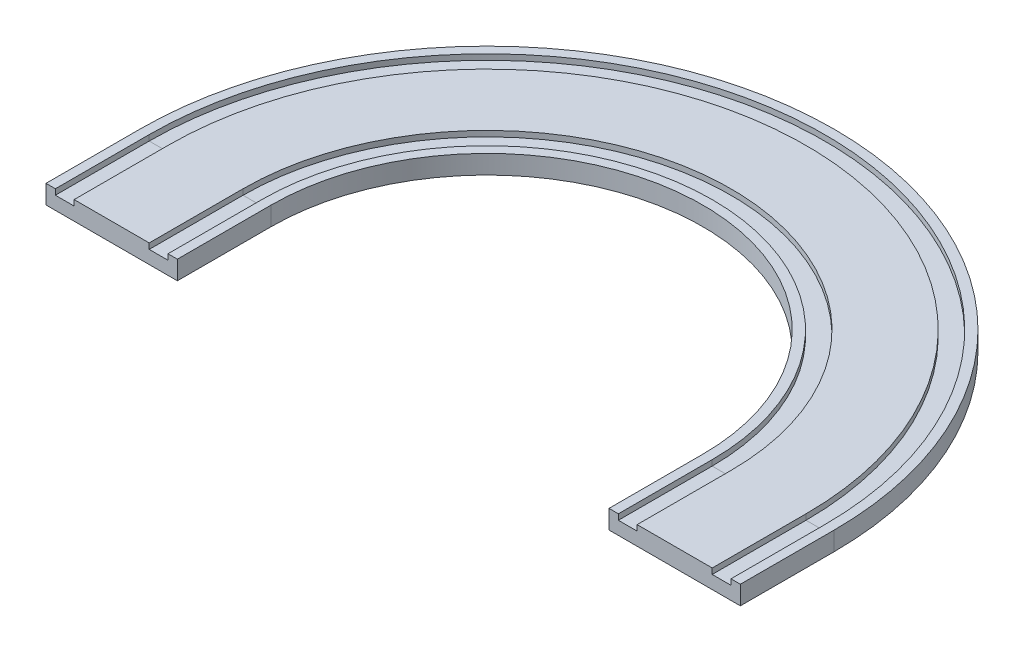
ISO-10303-21;
HEADER;
FILE_DESCRIPTION(('STEP AP214'),'2;1');
FILE_NAME('part.step','',(''),(''),'','','');
FILE_SCHEMA(('AUTOMOTIVE_DESIGN { 1 0 10303 214 1 1 1 1 }'));
ENDSEC;
DATA;
#1=APPLICATION_CONTEXT('core data for automotive mechanical design processes');
#2=APPLICATION_PROTOCOL_DEFINITION('international standard','automotive_design',2000,#1);
#3=PRODUCT_CONTEXT('',#1,'mechanical');
#4=PRODUCT('Part','Part','',(#3));
#5=PRODUCT_RELATED_PRODUCT_CATEGORY('part','',(#4));
#6=PRODUCT_DEFINITION_FORMATION('','',#4);
#7=PRODUCT_DEFINITION_CONTEXT('part definition',#1,'design');
#8=PRODUCT_DEFINITION('design','',#6,#7);
#9=PRODUCT_DEFINITION_SHAPE('','',#8);
#10=(LENGTH_UNIT() NAMED_UNIT(*) SI_UNIT(.MILLI.,.METRE.));
#11=(NAMED_UNIT(*) PLANE_ANGLE_UNIT() SI_UNIT($,.RADIAN.));
#12=(NAMED_UNIT(*) SI_UNIT($,.STERADIAN.) SOLID_ANGLE_UNIT());
#13=UNCERTAINTY_MEASURE_WITH_UNIT(LENGTH_MEASURE(1.E-05),#10,'distance_accuracy_value','');
#14=(GEOMETRIC_REPRESENTATION_CONTEXT(3) GLOBAL_UNCERTAINTY_ASSIGNED_CONTEXT((#13)) GLOBAL_UNIT_ASSIGNED_CONTEXT((#10,
#11,#12)) REPRESENTATION_CONTEXT('',''));
#15=CARTESIAN_POINT('',(0.,0.,0.));
#16=DIRECTION('',(0.,0.,1.));
#17=DIRECTION('',(1.,0.,0.));
#18=AXIS2_PLACEMENT_3D('',#15,#16,#17);
#19=CARTESIAN_POINT('',(265.,10.,8.04911692853238E-13));
#20=DIRECTION('',(0.,0.,-1.));
#21=DIRECTION('',(-1.,0.,0.));
#22=AXIS2_PLACEMENT_3D('',#19,#20,#21);
#23=PLANE('',#22);
#24=DIRECTION('',(0.,-1.,0.));
#25=VECTOR('',#24,1.);
#26=CARTESIAN_POINT('',(280.,10.,9.29811783123569E-13));
#27=LINE('',#26,#25);
#28=CARTESIAN_POINT('',(280.,10.,9.29811783123569E-13));
#29=VERTEX_POINT('',#28);
#30=CARTESIAN_POINT('',(280.,7.,9.29811783123572E-13));
#31=VERTEX_POINT('',#30);
#32=EDGE_CURVE('E462',#29,#31,#27,.T.);
#33=ORIENTED_EDGE('',*,*,#32,.T.);
#34=DIRECTION('',(-1.,0.,0.));
#35=VECTOR('',#34,1.);
#36=CARTESIAN_POINT('',(270.,7.,8.46545056276682E-13));
#37=LINE('',#36,#35);
#38=CARTESIAN_POINT('',(270.,7.,8.46545056276682E-13));
#39=VERTEX_POINT('',#38);
#40=EDGE_CURVE('E319',#31,#39,#37,.T.);
#41=ORIENTED_EDGE('',*,*,#40,.T.);
#42=DIRECTION('',(0.,1.,0.));
#43=VECTOR('',#42,1.);
#44=CARTESIAN_POINT('',(270.,10.,8.46545056276682E-13));
#45=LINE('',#44,#43);
#46=CARTESIAN_POINT('',(270.,10.,8.46545056276682E-13));
#47=VERTEX_POINT('',#46);
#48=EDGE_CURVE('E459',#39,#47,#45,.T.);
#49=ORIENTED_EDGE('',*,*,#48,.T.);
#50=DIRECTION('',(1.,0.,0.));
#51=VECTOR('',#50,1.);
#52=CARTESIAN_POINT('',(265.,10.,8.04911692853238E-13));
#53=LINE('',#52,#51);
#54=CARTESIAN_POINT('',(265.,10.,8.04911692853238E-13));
#55=VERTEX_POINT('',#54);
#56=EDGE_CURVE('E338',#55,#47,#53,.T.);
#57=ORIENTED_EDGE('',*,*,#56,.F.);
#58=DIRECTION('',(0.,-1.,0.));
#59=VECTOR('',#58,1.);
#60=CARTESIAN_POINT('',(265.,10.,8.04911692853238E-13));
#61=LINE('',#60,#59);
#62=CARTESIAN_POINT('',(265.,0.,8.04911692853238E-13));
#63=VERTEX_POINT('',#62);
#64=EDGE_CURVE('E382',#55,#63,#61,.T.);
#65=ORIENTED_EDGE('',*,*,#64,.T.);
#66=DIRECTION('',(1.,0.,0.));
#67=VECTOR('',#66,1.);
#68=CARTESIAN_POINT('',(265.,0.,8.04911692853238E-13));
#69=LINE('',#68,#67);
#70=CARTESIAN_POINT('',(335.,0.,1.38777878078145E-12));
#71=VERTEX_POINT('',#70);
#72=EDGE_CURVE('E359',#63,#71,#69,.T.);
#73=ORIENTED_EDGE('',*,*,#72,.T.);
#74=DIRECTION('',(0.,-1.,0.));
#75=VECTOR('',#74,1.);
#76=CARTESIAN_POINT('',(335.,10.,1.38777878078145E-12));
#77=LINE('',#76,#75);
#78=CARTESIAN_POINT('',(335.,10.,1.38777878078145E-12));
#79=VERTEX_POINT('',#78);
#80=EDGE_CURVE('E379',#79,#71,#77,.T.);
#81=ORIENTED_EDGE('',*,*,#80,.F.);
#82=CARTESIAN_POINT('',(330.,10.,1.30451205393456E-12));
#83=VERTEX_POINT('',#82);
#84=EDGE_CURVE('E337',#83,#79,#53,.T.);
#85=ORIENTED_EDGE('',*,*,#84,.F.);
#86=DIRECTION('',(0.,-1.,0.));
#87=VECTOR('',#86,1.);
#88=CARTESIAN_POINT('',(330.,10.,1.346145417358E-12));
#89=LINE('',#88,#87);
#90=CARTESIAN_POINT('',(330.,7.,1.34614541735801E-12));
#91=VERTEX_POINT('',#90);
#92=EDGE_CURVE('E269',#83,#91,#89,.T.);
#93=ORIENTED_EDGE('',*,*,#92,.T.);
#94=DIRECTION('',(-1.,0.,0.));
#95=VECTOR('',#94,1.);
#96=CARTESIAN_POINT('',(330.,7.,1.346145417358E-12));
#97=LINE('',#96,#95);
#98=CARTESIAN_POINT('',(320.,7.,1.26287869051112E-12));
#99=VERTEX_POINT('',#98);
#100=EDGE_CURVE('E266',#91,#99,#97,.T.);
#101=ORIENTED_EDGE('',*,*,#100,.T.);
#102=DIRECTION('',(0.,1.,0.));
#103=VECTOR('',#102,1.);
#104=CARTESIAN_POINT('',(320.,10.,1.26287869051112E-12));
#105=LINE('',#104,#103);
#106=CARTESIAN_POINT('',(320.,10.,1.26287869051112E-12));
#107=VERTEX_POINT('',#106);
#108=EDGE_CURVE('E262',#99,#107,#105,.T.);
#109=ORIENTED_EDGE('',*,*,#108,.T.);
#110=EDGE_CURVE('E342',#29,#107,#53,.T.);
#111=ORIENTED_EDGE('',*,*,#110,.F.);
#112=EDGE_LOOP('',(#33,#41,#49,#57,#65,#73,#81,#85,#93,#101,#109,#111));
#113=FACE_BOUND('',#112,.T.);
#114=ADVANCED_FACE('F59',(#113),#23,.F.);
#115=CARTESIAN_POINT('',(-35.,10.,0.));
#116=DIRECTION('',(0.,0.,-1.));
#117=DIRECTION('',(-1.,0.,0.));
#118=AXIS2_PLACEMENT_3D('',#115,#116,#117);
#119=PLANE('',#118);
#120=DIRECTION('',(0.,1.,0.));
#121=VECTOR('',#120,1.);
#122=CARTESIAN_POINT('',(20.,10.,0.));
#123=LINE('',#122,#121);
#124=CARTESIAN_POINT('',(20.,7.,0.));
#125=VERTEX_POINT('',#124);
#126=CARTESIAN_POINT('',(20.,10.,0.));
#127=VERTEX_POINT('',#126);
#128=EDGE_CURVE('E254',#125,#127,#123,.T.);
#129=ORIENTED_EDGE('',*,*,#128,.T.);
#130=DIRECTION('',(1.,0.,0.));
#131=VECTOR('',#130,1.);
#132=CARTESIAN_POINT('',(-35.,10.,0.));
#133=LINE('',#132,#131);
#134=CARTESIAN_POINT('',(-20.,10.,0.));
#135=VERTEX_POINT('',#134);
#136=EDGE_CURVE('E352',#135,#127,#133,.T.);
#137=ORIENTED_EDGE('',*,*,#136,.F.);
#138=DIRECTION('',(0.,-1.,0.));
#139=VECTOR('',#138,1.);
#140=CARTESIAN_POINT('',(-20.,10.,0.));
#141=LINE('',#140,#139);
#142=CARTESIAN_POINT('',(-20.,7.,0.));
#143=VERTEX_POINT('',#142);
#144=EDGE_CURVE('E297',#135,#143,#141,.T.);
#145=ORIENTED_EDGE('',*,*,#144,.T.);
#146=DIRECTION('',(-1.,0.,0.));
#147=VECTOR('',#146,1.);
#148=CARTESIAN_POINT('',(-30.,7.,0.));
#149=LINE('',#148,#147);
#150=CARTESIAN_POINT('',(-30.,7.,0.));
#151=VERTEX_POINT('',#150);
#152=EDGE_CURVE('E314',#143,#151,#149,.T.);
#153=ORIENTED_EDGE('',*,*,#152,.T.);
#154=DIRECTION('',(0.,1.,0.));
#155=VECTOR('',#154,1.);
#156=CARTESIAN_POINT('',(-30.,10.,0.));
#157=LINE('',#156,#155);
#158=CARTESIAN_POINT('',(-30.,10.,0.));
#159=VERTEX_POINT('',#158);
#160=EDGE_CURVE('E316',#151,#159,#157,.T.);
#161=ORIENTED_EDGE('',*,*,#160,.T.);
#162=CARTESIAN_POINT('',(-35.,10.,0.));
#163=VERTEX_POINT('',#162);
#164=EDGE_CURVE('E348',#163,#159,#133,.T.);
#165=ORIENTED_EDGE('',*,*,#164,.F.);
#166=DIRECTION('',(0.,-1.,0.));
#167=VECTOR('',#166,1.);
#168=CARTESIAN_POINT('',(-35.,10.,0.));
#169=LINE('',#168,#167);
#170=CARTESIAN_POINT('',(-35.,0.,0.));
#171=VERTEX_POINT('',#170);
#172=EDGE_CURVE('E370',#163,#171,#169,.T.);
#173=ORIENTED_EDGE('',*,*,#172,.T.);
#174=DIRECTION('',(1.,0.,0.));
#175=VECTOR('',#174,1.);
#176=CARTESIAN_POINT('',(-35.,0.,0.));
#177=LINE('',#176,#175);
#178=CARTESIAN_POINT('',(35.,0.,0.));
#179=VERTEX_POINT('',#178);
#180=EDGE_CURVE('E333',#171,#179,#177,.T.);
#181=ORIENTED_EDGE('',*,*,#180,.T.);
#182=DIRECTION('',(0.,-1.,0.));
#183=VECTOR('',#182,1.);
#184=CARTESIAN_POINT('',(35.,10.,0.));
#185=LINE('',#184,#183);
#186=CARTESIAN_POINT('',(35.,10.,0.));
#187=VERTEX_POINT('',#186);
#188=EDGE_CURVE('E351',#187,#179,#185,.T.);
#189=ORIENTED_EDGE('',*,*,#188,.F.);
#190=CARTESIAN_POINT('',(30.,10.,0.));
#191=VERTEX_POINT('',#190);
#192=EDGE_CURVE('E246',#191,#187,#133,.T.);
#193=ORIENTED_EDGE('',*,*,#192,.F.);
#194=DIRECTION('',(0.,-1.,0.));
#195=VECTOR('',#194,1.);
#196=CARTESIAN_POINT('',(30.,10.,0.));
#197=LINE('',#196,#195);
#198=CARTESIAN_POINT('',(30.,7.,0.));
#199=VERTEX_POINT('',#198);
#200=EDGE_CURVE('E238',#191,#199,#197,.T.);
#201=ORIENTED_EDGE('',*,*,#200,.T.);
#202=DIRECTION('',(-1.,0.,0.));
#203=VECTOR('',#202,1.);
#204=CARTESIAN_POINT('',(30.,7.,0.));
#205=LINE('',#204,#203);
#206=EDGE_CURVE('E223',#199,#125,#205,.T.);
#207=ORIENTED_EDGE('',*,*,#206,.T.);
#208=EDGE_LOOP('',(#129,#137,#145,#153,#161,#165,#173,#181,#189,#193,#201,#207));
#209=FACE_BOUND('',#208,.T.);
#210=ADVANCED_FACE('F244',(#209),#119,.F.);
#211=CARTESIAN_POINT('',(150.,10.,-50.));
#212=DIRECTION('',(0.,-1.,0.));
#213=DIRECTION('',(0.,0.,-1.));
#214=AXIS2_PLACEMENT_3D('',#211,#212,#213);
#215=PLANE('',#214);
#216=DIRECTION('',(0.,0.,-1.));
#217=VECTOR('',#216,1.);
#218=CARTESIAN_POINT('',(20.,10.,5.));
#219=LINE('',#218,#217);
#220=CARTESIAN_POINT('',(20.,10.,-50.));
#221=VERTEX_POINT('',#220);
#222=EDGE_CURVE('E255',#127,#221,#219,.T.);
#223=ORIENTED_EDGE('',*,*,#222,.T.);
#224=CARTESIAN_POINT('',(150.,10.,-50.));
#225=DIRECTION('',(0.,-1.,0.));
#226=DIRECTION('',(-1.,0.,0.));
#227=AXIS2_PLACEMENT_3D('',#224,#225,#226);
#228=CIRCLE('',#227,130.);
#229=CARTESIAN_POINT('',(280.,10.,-49.9999999999991));
#230=VERTEX_POINT('',#229);
#231=EDGE_CURVE('E251',#221,#230,#228,.T.);
#232=ORIENTED_EDGE('',*,*,#231,.T.);
#233=DIRECTION('',(0.,0.,1.));
#234=VECTOR('',#233,1.);
#235=CARTESIAN_POINT('',(280.,10.,-49.9999999999991));
#236=LINE('',#235,#234);
#237=EDGE_CURVE('E418',#230,#29,#236,.T.);
#238=ORIENTED_EDGE('',*,*,#237,.T.);
#239=ORIENTED_EDGE('',*,*,#110,.T.);
#240=DIRECTION('',(0.,0.,1.));
#241=VECTOR('',#240,1.);
#242=CARTESIAN_POINT('',(320.,10.,-49.9999999999988));
#243=LINE('',#242,#241);
#244=CARTESIAN_POINT('',(320.,10.,-49.9999999999988));
#245=VERTEX_POINT('',#244);
#246=EDGE_CURVE('E272',#245,#107,#243,.T.);
#247=ORIENTED_EDGE('',*,*,#246,.F.);
#248=CARTESIAN_POINT('',(150.,10.,-50.));
#249=DIRECTION('',(0.,-1.,0.));
#250=DIRECTION('',(-1.,0.,0.));
#251=AXIS2_PLACEMENT_3D('',#248,#249,#250);
#252=CIRCLE('',#251,170.);
#253=CARTESIAN_POINT('',(-20.,10.,-50.));
#254=VERTEX_POINT('',#253);
#255=EDGE_CURVE('E275',#254,#245,#252,.T.);
#256=ORIENTED_EDGE('',*,*,#255,.F.);
#257=DIRECTION('',(0.,0.,-1.));
#258=VECTOR('',#257,1.);
#259=CARTESIAN_POINT('',(-20.,10.,5.));
#260=LINE('',#259,#258);
#261=EDGE_CURVE('E283',#135,#254,#260,.T.);
#262=ORIENTED_EDGE('',*,*,#261,.F.);
#263=ORIENTED_EDGE('',*,*,#136,.T.);
#264=EDGE_LOOP('',(#223,#232,#238,#239,#247,#256,#262,#263));
#265=FACE_BOUND('',#264,.T.);
#266=ADVANCED_FACE('F415',(#265),#215,.F.);
#267=DIRECTION('',(0.,0.,-1.));
#268=VECTOR('',#267,1.);
#269=CARTESIAN_POINT('',(30.,10.,5.));
#270=LINE('',#269,#268);
#271=CARTESIAN_POINT('',(30.,10.,-50.));
#272=VERTEX_POINT('',#271);
#273=EDGE_CURVE('E256',#191,#272,#270,.T.);
#274=ORIENTED_EDGE('',*,*,#273,.F.);
#275=ORIENTED_EDGE('',*,*,#192,.T.);
#276=DIRECTION('',(0.,0.,-1.));
#277=VECTOR('',#276,1.);
#278=CARTESIAN_POINT('',(35.,10.,0.));
#279=LINE('',#278,#277);
#280=CARTESIAN_POINT('',(35.,10.,-50.));
#281=VERTEX_POINT('',#280);
#282=EDGE_CURVE('E329',#187,#281,#279,.T.);
#283=ORIENTED_EDGE('',*,*,#282,.T.);
#284=CARTESIAN_POINT('',(150.,10.,-50.));
#285=DIRECTION('',(0.,-1.,0.));
#286=DIRECTION('',(0.,0.,-1.));
#287=AXIS2_PLACEMENT_3D('',#284,#285,#286);
#288=CIRCLE('',#287,115.);
#289=CARTESIAN_POINT('',(265.,10.,-49.9999999999992));
#290=VERTEX_POINT('',#289);
#291=EDGE_CURVE('E332',#281,#290,#288,.T.);
#292=ORIENTED_EDGE('',*,*,#291,.T.);
#293=DIRECTION('',(0.,0.,1.));
#294=VECTOR('',#293,1.);
#295=CARTESIAN_POINT('',(265.,10.,-49.9999999999992));
#296=LINE('',#295,#294);
#297=EDGE_CURVE('E335',#290,#55,#296,.T.);
#298=ORIENTED_EDGE('',*,*,#297,.T.);
#299=ORIENTED_EDGE('',*,*,#56,.T.);
#300=DIRECTION('',(0.,0.,1.));
#301=VECTOR('',#300,1.);
#302=CARTESIAN_POINT('',(270.,10.,-49.9999999999992));
#303=LINE('',#302,#301);
#304=CARTESIAN_POINT('',(270.,10.,-49.9999999999992));
#305=VERTEX_POINT('',#304);
#306=EDGE_CURVE('E477',#305,#47,#303,.T.);
#307=ORIENTED_EDGE('',*,*,#306,.F.);
#308=CARTESIAN_POINT('',(150.,10.,-50.));
#309=DIRECTION('',(0.,-1.,0.));
#310=DIRECTION('',(-1.,0.,0.));
#311=AXIS2_PLACEMENT_3D('',#308,#309,#310);
#312=CIRCLE('',#311,120.);
#313=EDGE_CURVE('E74',#272,#305,#312,.T.);
#314=ORIENTED_EDGE('',*,*,#313,.F.);
#315=EDGE_LOOP('',(#274,#275,#283,#292,#298,#299,#307,#314));
#316=FACE_BOUND('',#315,.T.);
#317=ADVANCED_FACE('F450',(#316),#215,.F.);
#318=DIRECTION('',(0.,0.,-1.));
#319=VECTOR('',#318,1.);
#320=CARTESIAN_POINT('',(-30.,10.,5.));
#321=LINE('',#320,#319);
#322=CARTESIAN_POINT('',(-30.,10.,-50.));
#323=VERTEX_POINT('',#322);
#324=EDGE_CURVE('E315',#159,#323,#321,.T.);
#325=ORIENTED_EDGE('',*,*,#324,.T.);
#326=CARTESIAN_POINT('',(150.,10.,-50.));
#327=DIRECTION('',(0.,-1.,0.));
#328=DIRECTION('',(-1.,0.,0.));
#329=AXIS2_PLACEMENT_3D('',#326,#327,#328);
#330=CIRCLE('',#329,180.);
#331=CARTESIAN_POINT('',(330.,10.,-49.9999999999988));
#332=VERTEX_POINT('',#331);
#333=EDGE_CURVE('E303',#323,#332,#330,.T.);
#334=ORIENTED_EDGE('',*,*,#333,.T.);
#335=DIRECTION('',(0.,0.,1.));
#336=VECTOR('',#335,1.);
#337=CARTESIAN_POINT('',(330.,10.,-49.9999999999988));
#338=LINE('',#337,#336);
#339=EDGE_CURVE('E277',#332,#83,#338,.T.);
#340=ORIENTED_EDGE('',*,*,#339,.T.);
#341=ORIENTED_EDGE('',*,*,#84,.T.);
#342=DIRECTION('',(0.,0.,-1.));
#343=VECTOR('',#342,1.);
#344=CARTESIAN_POINT('',(335.,10.,1.38777878078145E-12));
#345=LINE('',#344,#343);
#346=CARTESIAN_POINT('',(335.,10.,-49.9999999999987));
#347=VERTEX_POINT('',#346);
#348=EDGE_CURVE('E341',#79,#347,#345,.T.);
#349=ORIENTED_EDGE('',*,*,#348,.T.);
#350=CARTESIAN_POINT('',(150.,10.,-50.));
#351=DIRECTION('',(0.,1.,0.));
#352=DIRECTION('',(0.,0.,1.));
#353=AXIS2_PLACEMENT_3D('',#350,#351,#352);
#354=CIRCLE('',#353,185.);
#355=CARTESIAN_POINT('',(-35.,10.,-50.));
#356=VERTEX_POINT('',#355);
#357=EDGE_CURVE('E344',#347,#356,#354,.T.);
#358=ORIENTED_EDGE('',*,*,#357,.T.);
#359=DIRECTION('',(0.,0.,1.));
#360=VECTOR('',#359,1.);
#361=CARTESIAN_POINT('',(-35.,10.,-50.));
#362=LINE('',#361,#360);
#363=EDGE_CURVE('E346',#356,#163,#362,.T.);
#364=ORIENTED_EDGE('',*,*,#363,.T.);
#365=ORIENTED_EDGE('',*,*,#164,.T.);
#366=EDGE_LOOP('',(#325,#334,#340,#341,#349,#358,#364,#365));
#367=FACE_BOUND('',#366,.T.);
#368=ADVANCED_FACE('F409',(#367),#215,.F.);
#369=CARTESIAN_POINT('',(35.,10.,0.));
#370=DIRECTION('',(-1.,0.,0.));
#371=DIRECTION('',(0.,0.,1.));
#372=AXIS2_PLACEMENT_3D('',#369,#370,#371);
#373=PLANE('',#372);
#374=DIRECTION('',(0.,0.,-1.));
#375=VECTOR('',#374,1.);
#376=CARTESIAN_POINT('',(35.,0.,0.));
#377=LINE('',#376,#375);
#378=CARTESIAN_POINT('',(35.,0.,-50.));
#379=VERTEX_POINT('',#378);
#380=EDGE_CURVE('E265',#179,#379,#377,.T.);
#381=ORIENTED_EDGE('',*,*,#380,.T.);
#382=DIRECTION('',(0.,-1.,0.));
#383=VECTOR('',#382,1.);
#384=CARTESIAN_POINT('',(35.,10.,-50.));
#385=LINE('',#384,#383);
#386=EDGE_CURVE('E12',#281,#379,#385,.T.);
#387=ORIENTED_EDGE('',*,*,#386,.F.);
#388=ORIENTED_EDGE('',*,*,#282,.F.);
#389=ORIENTED_EDGE('',*,*,#188,.T.);
#390=EDGE_LOOP('',(#381,#387,#388,#389));
#391=FACE_BOUND('',#390,.T.);
#392=ADVANCED_FACE('F61',(#391),#373,.F.);
#393=CARTESIAN_POINT('',(150.,10.,-50.));
#394=DIRECTION('',(0.,-1.,0.));
#395=DIRECTION('',(0.,0.,-1.));
#396=AXIS2_PLACEMENT_3D('',#393,#394,#395);
#397=CYLINDRICAL_SURFACE('',#396,115.);
#398=CARTESIAN_POINT('',(150.,0.,-50.));
#399=DIRECTION('',(0.,-1.,0.));
#400=DIRECTION('',(0.,0.,-1.));
#401=AXIS2_PLACEMENT_3D('',#398,#399,#400);
#402=CIRCLE('',#401,115.);
#403=CARTESIAN_POINT('',(265.,0.,-49.9999999999992));
#404=VERTEX_POINT('',#403);
#405=EDGE_CURVE('E355',#379,#404,#402,.T.);
#406=ORIENTED_EDGE('',*,*,#405,.T.);
#407=DIRECTION('',(0.,-1.,0.));
#408=VECTOR('',#407,1.);
#409=CARTESIAN_POINT('',(265.,10.,-49.9999999999992));
#410=LINE('',#409,#408);
#411=EDGE_CURVE('E67',#290,#404,#410,.T.);
#412=ORIENTED_EDGE('',*,*,#411,.F.);
#413=ORIENTED_EDGE('',*,*,#291,.F.);
#414=ORIENTED_EDGE('',*,*,#386,.T.);
#415=EDGE_LOOP('',(#406,#412,#413,#414));
#416=FACE_BOUND('',#415,.T.);
#417=ADVANCED_FACE('F455',(#416),#397,.F.);
#418=CARTESIAN_POINT('',(265.,10.,-49.9999999999992));
#419=DIRECTION('',(1.,0.,0.));
#420=DIRECTION('',(0.,0.,-1.));
#421=AXIS2_PLACEMENT_3D('',#418,#419,#420);
#422=PLANE('',#421);
#423=DIRECTION('',(0.,0.,1.));
#424=VECTOR('',#423,1.);
#425=CARTESIAN_POINT('',(265.,0.,-49.9999999999992));
#426=LINE('',#425,#424);
#427=EDGE_CURVE('E357',#404,#63,#426,.T.);
#428=ORIENTED_EDGE('',*,*,#427,.T.);
#429=ORIENTED_EDGE('',*,*,#64,.F.);
#430=ORIENTED_EDGE('',*,*,#297,.F.);
#431=ORIENTED_EDGE('',*,*,#411,.T.);
#432=EDGE_LOOP('',(#428,#429,#430,#431));
#433=FACE_BOUND('',#432,.T.);
#434=ADVANCED_FACE('F389',(#433),#422,.F.);
#435=CARTESIAN_POINT('',(335.,10.,1.38777878078145E-12));
#436=DIRECTION('',(-1.,0.,0.));
#437=DIRECTION('',(0.,0.,1.));
#438=AXIS2_PLACEMENT_3D('',#435,#436,#437);
#439=PLANE('',#438);
#440=DIRECTION('',(0.,0.,-1.));
#441=VECTOR('',#440,1.);
#442=CARTESIAN_POINT('',(335.,0.,1.38777878078145E-12));
#443=LINE('',#442,#441);
#444=CARTESIAN_POINT('',(335.,0.,-49.9999999999987));
#445=VERTEX_POINT('',#444);
#446=EDGE_CURVE('E361',#71,#445,#443,.T.);
#447=ORIENTED_EDGE('',*,*,#446,.T.);
#448=DIRECTION('',(0.,-1.,0.));
#449=VECTOR('',#448,1.);
#450=CARTESIAN_POINT('',(335.,10.,-49.9999999999987));
#451=LINE('',#450,#449);
#452=EDGE_CURVE('E376',#347,#445,#451,.T.);
#453=ORIENTED_EDGE('',*,*,#452,.F.);
#454=ORIENTED_EDGE('',*,*,#348,.F.);
#455=ORIENTED_EDGE('',*,*,#80,.T.);
#456=EDGE_LOOP('',(#447,#453,#454,#455));
#457=FACE_BOUND('',#456,.T.);
#458=ADVANCED_FACE('F405',(#457),#439,.F.);
#459=CARTESIAN_POINT('',(150.,10.,-50.));
#460=DIRECTION('',(0.,-1.,0.));
#461=DIRECTION('',(0.,0.,-1.));
#462=AXIS2_PLACEMENT_3D('',#459,#460,#461);
#463=CYLINDRICAL_SURFACE('',#462,185.);
#464=CARTESIAN_POINT('',(150.,0.,-50.));
#465=DIRECTION('',(0.,1.,0.));
#466=DIRECTION('',(0.,0.,1.));
#467=AXIS2_PLACEMENT_3D('',#464,#465,#466);
#468=CIRCLE('',#467,185.);
#469=CARTESIAN_POINT('',(-35.,0.,-50.));
#470=VERTEX_POINT('',#469);
#471=EDGE_CURVE('E363',#445,#470,#468,.T.);
#472=ORIENTED_EDGE('',*,*,#471,.T.);
#473=DIRECTION('',(0.,-1.,0.));
#474=VECTOR('',#473,1.);
#475=CARTESIAN_POINT('',(-35.,10.,-50.));
#476=LINE('',#475,#474);
#477=EDGE_CURVE('E373',#356,#470,#476,.T.);
#478=ORIENTED_EDGE('',*,*,#477,.F.);
#479=ORIENTED_EDGE('',*,*,#357,.F.);
#480=ORIENTED_EDGE('',*,*,#452,.T.);
#481=EDGE_LOOP('',(#472,#478,#479,#480));
#482=FACE_BOUND('',#481,.T.);
#483=ADVANCED_FACE('F763',(#482),#463,.T.);
#484=CARTESIAN_POINT('',(-35.,10.,-50.));
#485=DIRECTION('',(1.,0.,0.));
#486=DIRECTION('',(0.,0.,-1.));
#487=AXIS2_PLACEMENT_3D('',#484,#485,#486);
#488=PLANE('',#487);
#489=DIRECTION('',(0.,0.,1.));
#490=VECTOR('',#489,1.);
#491=CARTESIAN_POINT('',(-35.,0.,-50.));
#492=LINE('',#491,#490);
#493=EDGE_CURVE('E365',#470,#171,#492,.T.);
#494=ORIENTED_EDGE('',*,*,#493,.T.);
#495=ORIENTED_EDGE('',*,*,#172,.F.);
#496=ORIENTED_EDGE('',*,*,#363,.F.);
#497=ORIENTED_EDGE('',*,*,#477,.T.);
#498=EDGE_LOOP('',(#494,#495,#496,#497));
#499=FACE_BOUND('',#498,.T.);
#500=ADVANCED_FACE('F755',(#499),#488,.F.);
#501=CARTESIAN_POINT('',(150.,0.,-50.));
#502=DIRECTION('',(0.,-1.,0.));
#503=DIRECTION('',(0.,0.,-1.));
#504=AXIS2_PLACEMENT_3D('',#501,#502,#503);
#505=PLANE('',#504);
#506=ORIENTED_EDGE('',*,*,#380,.F.);
#507=ORIENTED_EDGE('',*,*,#180,.F.);
#508=ORIENTED_EDGE('',*,*,#493,.F.);
#509=ORIENTED_EDGE('',*,*,#471,.F.);
#510=ORIENTED_EDGE('',*,*,#446,.F.);
#511=ORIENTED_EDGE('',*,*,#72,.F.);
#512=ORIENTED_EDGE('',*,*,#427,.F.);
#513=ORIENTED_EDGE('',*,*,#405,.F.);
#514=EDGE_LOOP('',(#506,#507,#508,#509,#510,#511,#512,#513));
#515=FACE_BOUND('',#514,.T.);
#516=ADVANCED_FACE('F395',(#515),#505,.T.);
#517=CARTESIAN_POINT('',(-30.,10.,5.));
#518=DIRECTION('',(1.,0.,0.));
#519=DIRECTION('',(0.,0.,-1.));
#520=AXIS2_PLACEMENT_3D('',#517,#518,#519);
#521=PLANE('',#520);
#522=DIRECTION('',(0.,0.,-1.));
#523=VECTOR('',#522,1.);
#524=CARTESIAN_POINT('',(-30.,7.,5.));
#525=LINE('',#524,#523);
#526=CARTESIAN_POINT('',(-30.,7.,-50.));
#527=VERTEX_POINT('',#526);
#528=EDGE_CURVE('E298',#151,#527,#525,.T.);
#529=ORIENTED_EDGE('',*,*,#528,.T.);
#530=DIRECTION('',(0.,-1.,0.));
#531=VECTOR('',#530,1.);
#532=CARTESIAN_POINT('',(-30.,10.,-50.));
#533=LINE('',#532,#531);
#534=EDGE_CURVE('E311',#323,#527,#533,.T.);
#535=ORIENTED_EDGE('',*,*,#534,.F.);
#536=ORIENTED_EDGE('',*,*,#324,.F.);
#537=ORIENTED_EDGE('',*,*,#160,.F.);
#538=EDGE_LOOP('',(#529,#535,#536,#537));
#539=FACE_BOUND('',#538,.T.);
#540=ADVANCED_FACE('F432',(#539),#521,.T.);
#541=CARTESIAN_POINT('',(-30.,7.,5.));
#542=DIRECTION('',(0.,1.,0.));
#543=DIRECTION('',(0.,0.,1.));
#544=AXIS2_PLACEMENT_3D('',#541,#542,#543);
#545=PLANE('',#544);
#546=DIRECTION('',(0.,0.,-1.));
#547=VECTOR('',#546,1.);
#548=CARTESIAN_POINT('',(-20.,7.,5.));
#549=LINE('',#548,#547);
#550=CARTESIAN_POINT('',(-20.,7.,-50.));
#551=VERTEX_POINT('',#550);
#552=EDGE_CURVE('E284',#143,#551,#549,.T.);
#553=ORIENTED_EDGE('',*,*,#552,.T.);
#554=DIRECTION('',(1.,0.,0.));
#555=VECTOR('',#554,1.);
#556=CARTESIAN_POINT('',(-30.,7.,-50.));
#557=LINE('',#556,#555);
#558=EDGE_CURVE('E294',#527,#551,#557,.T.);
#559=ORIENTED_EDGE('',*,*,#558,.F.);
#560=ORIENTED_EDGE('',*,*,#528,.F.);
#561=ORIENTED_EDGE('',*,*,#152,.F.);
#562=EDGE_LOOP('',(#553,#559,#560,#561));
#563=FACE_BOUND('',#562,.T.);
#564=ADVANCED_FACE('F437',(#563),#545,.T.);
#565=CARTESIAN_POINT('',(-20.,10.,5.));
#566=DIRECTION('',(-1.,0.,0.));
#567=DIRECTION('',(0.,-1.,0.));
#568=AXIS2_PLACEMENT_3D('',#565,#566,#567);
#569=PLANE('',#568);
#570=ORIENTED_EDGE('',*,*,#261,.T.);
#571=DIRECTION('',(0.,1.,0.));
#572=VECTOR('',#571,1.);
#573=CARTESIAN_POINT('',(-20.,10.,-50.));
#574=LINE('',#573,#572);
#575=EDGE_CURVE('E280',#551,#254,#574,.T.);
#576=ORIENTED_EDGE('',*,*,#575,.F.);
#577=ORIENTED_EDGE('',*,*,#552,.F.);
#578=ORIENTED_EDGE('',*,*,#144,.F.);
#579=EDGE_LOOP('',(#570,#576,#577,#578));
#580=FACE_BOUND('',#579,.T.);
#581=ADVANCED_FACE('F442',(#580),#569,.T.);
#582=CARTESIAN_POINT('',(150.,10.,-50.));
#583=DIRECTION('',(0.,-1.,0.));
#584=DIRECTION('',(0.,0.,-1.));
#585=AXIS2_PLACEMENT_3D('',#582,#583,#584);
#586=CYLINDRICAL_SURFACE('',#585,180.);
#587=CARTESIAN_POINT('',(150.,7.,-50.));
#588=DIRECTION('',(0.,-1.,0.));
#589=DIRECTION('',(-1.,0.,0.));
#590=AXIS2_PLACEMENT_3D('',#587,#588,#589);
#591=CIRCLE('',#590,180.);
#592=CARTESIAN_POINT('',(330.,7.,-49.9999999999988));
#593=VERTEX_POINT('',#592);
#594=EDGE_CURVE('E293',#527,#593,#591,.T.);
#595=ORIENTED_EDGE('',*,*,#594,.T.);
#596=DIRECTION('',(0.,-1.,0.));
#597=VECTOR('',#596,1.);
#598=CARTESIAN_POINT('',(330.,10.,-49.9999999999987));
#599=LINE('',#598,#597);
#600=EDGE_CURVE('E306',#332,#593,#599,.T.);
#601=ORIENTED_EDGE('',*,*,#600,.F.);
#602=ORIENTED_EDGE('',*,*,#333,.F.);
#603=ORIENTED_EDGE('',*,*,#534,.T.);
#604=EDGE_LOOP('',(#595,#601,#602,#603));
#605=FACE_BOUND('',#604,.T.);
#606=ADVANCED_FACE('F427',(#605),#586,.F.);
#607=CARTESIAN_POINT('',(-30.,7.,-50.));
#608=DIRECTION('',(0.,1.,0.));
#609=DIRECTION('',(0.,0.,1.));
#610=AXIS2_PLACEMENT_3D('',#607,#608,#609);
#611=PLANE('',#610);
#612=CARTESIAN_POINT('',(150.,7.,-50.));
#613=DIRECTION('',(0.,-1.,0.));
#614=DIRECTION('',(-1.,0.,0.));
#615=AXIS2_PLACEMENT_3D('',#612,#613,#614);
#616=CIRCLE('',#615,170.);
#617=CARTESIAN_POINT('',(320.,7.,-49.9999999999988));
#618=VERTEX_POINT('',#617);
#619=EDGE_CURVE('E279',#551,#618,#616,.T.);
#620=ORIENTED_EDGE('',*,*,#619,.T.);
#621=DIRECTION('',(-1.,0.,0.));
#622=VECTOR('',#621,1.);
#623=CARTESIAN_POINT('',(330.,7.,-49.9999999999987));
#624=LINE('',#623,#622);
#625=EDGE_CURVE('E290',#593,#618,#624,.T.);
#626=ORIENTED_EDGE('',*,*,#625,.F.);
#627=ORIENTED_EDGE('',*,*,#594,.F.);
#628=ORIENTED_EDGE('',*,*,#558,.T.);
#629=EDGE_LOOP('',(#620,#626,#627,#628));
#630=FACE_BOUND('',#629,.T.);
#631=ADVANCED_FACE('F446',(#630),#611,.T.);
#632=CARTESIAN_POINT('',(150.,10.,-50.));
#633=DIRECTION('',(0.,-1.,0.));
#634=DIRECTION('',(0.,0.,-1.));
#635=AXIS2_PLACEMENT_3D('',#632,#633,#634);
#636=CYLINDRICAL_SURFACE('',#635,170.);
#637=ORIENTED_EDGE('',*,*,#255,.T.);
#638=DIRECTION('',(0.,1.,0.));
#639=VECTOR('',#638,1.);
#640=CARTESIAN_POINT('',(320.,10.,-49.9999999999988));
#641=LINE('',#640,#639);
#642=EDGE_CURVE('E82',#618,#245,#641,.T.);
#643=ORIENTED_EDGE('',*,*,#642,.F.);
#644=ORIENTED_EDGE('',*,*,#619,.F.);
#645=ORIENTED_EDGE('',*,*,#575,.T.);
#646=EDGE_LOOP('',(#637,#643,#644,#645));
#647=FACE_BOUND('',#646,.T.);
#648=ADVANCED_FACE('F447',(#647),#636,.T.);
#649=CARTESIAN_POINT('',(330.,10.,-49.9999999999988));
#650=DIRECTION('',(-1.,0.,0.));
#651=DIRECTION('',(0.,0.,1.));
#652=AXIS2_PLACEMENT_3D('',#649,#650,#651);
#653=PLANE('',#652);
#654=ORIENTED_EDGE('',*,*,#339,.F.);
#655=ORIENTED_EDGE('',*,*,#600,.T.);
#656=DIRECTION('',(0.,0.,1.));
#657=VECTOR('',#656,1.);
#658=CARTESIAN_POINT('',(330.,7.,-49.9999999999988));
#659=LINE('',#658,#657);
#660=EDGE_CURVE('E287',#593,#91,#659,.T.);
#661=ORIENTED_EDGE('',*,*,#660,.T.);
#662=ORIENTED_EDGE('',*,*,#92,.F.);
#663=EDGE_LOOP('',(#654,#655,#661,#662));
#664=FACE_BOUND('',#663,.T.);
#665=ADVANCED_FACE('F424',(#664),#653,.T.);
#666=CARTESIAN_POINT('',(330.,7.,-49.9999999999988));
#667=DIRECTION('',(0.,1.,0.));
#668=DIRECTION('',(0.,0.,1.));
#669=AXIS2_PLACEMENT_3D('',#666,#667,#668);
#670=PLANE('',#669);
#671=ORIENTED_EDGE('',*,*,#660,.F.);
#672=ORIENTED_EDGE('',*,*,#625,.T.);
#673=DIRECTION('',(0.,0.,1.));
#674=VECTOR('',#673,1.);
#675=CARTESIAN_POINT('',(320.,7.,-49.9999999999988));
#676=LINE('',#675,#674);
#677=EDGE_CURVE('E274',#618,#99,#676,.T.);
#678=ORIENTED_EDGE('',*,*,#677,.T.);
#679=ORIENTED_EDGE('',*,*,#100,.F.);
#680=EDGE_LOOP('',(#671,#672,#678,#679));
#681=FACE_BOUND('',#680,.T.);
#682=ADVANCED_FACE('F421',(#681),#670,.T.);
#683=CARTESIAN_POINT('',(320.,10.,-49.9999999999988));
#684=DIRECTION('',(1.,0.,0.));
#685=DIRECTION('',(0.,0.,-1.));
#686=AXIS2_PLACEMENT_3D('',#683,#684,#685);
#687=PLANE('',#686);
#688=ORIENTED_EDGE('',*,*,#677,.F.);
#689=ORIENTED_EDGE('',*,*,#642,.T.);
#690=ORIENTED_EDGE('',*,*,#246,.T.);
#691=ORIENTED_EDGE('',*,*,#108,.F.);
#692=EDGE_LOOP('',(#688,#689,#690,#691));
#693=FACE_BOUND('',#692,.T.);
#694=ADVANCED_FACE('F419',(#693),#687,.T.);
#695=CARTESIAN_POINT('',(20.,10.,5.));
#696=DIRECTION('',(1.,0.,0.));
#697=DIRECTION('',(0.,0.,-1.));
#698=AXIS2_PLACEMENT_3D('',#695,#696,#697);
#699=PLANE('',#698);
#700=DIRECTION('',(0.,0.,-1.));
#701=VECTOR('',#700,1.);
#702=CARTESIAN_POINT('',(20.,7.,5.));
#703=LINE('',#702,#701);
#704=CARTESIAN_POINT('',(20.,7.,-50.));
#705=VERTEX_POINT('',#704);
#706=EDGE_CURVE('E229',#125,#705,#703,.T.);
#707=ORIENTED_EDGE('',*,*,#706,.T.);
#708=DIRECTION('',(0.,-1.,0.));
#709=VECTOR('',#708,1.);
#710=CARTESIAN_POINT('',(20.,10.,-50.));
#711=LINE('',#710,#709);
#712=EDGE_CURVE('E233',#221,#705,#711,.T.);
#713=ORIENTED_EDGE('',*,*,#712,.F.);
#714=ORIENTED_EDGE('',*,*,#222,.F.);
#715=ORIENTED_EDGE('',*,*,#128,.F.);
#716=EDGE_LOOP('',(#707,#713,#714,#715));
#717=FACE_BOUND('',#716,.T.);
#718=ADVANCED_FACE('F496',(#717),#699,.T.);
#719=CARTESIAN_POINT('',(30.,7.,5.));
#720=DIRECTION('',(0.,1.,0.));
#721=DIRECTION('',(0.,0.,1.));
#722=AXIS2_PLACEMENT_3D('',#719,#720,#721);
#723=PLANE('',#722);
#724=DIRECTION('',(0.,0.,-1.));
#725=VECTOR('',#724,1.);
#726=CARTESIAN_POINT('',(30.,7.,5.));
#727=LINE('',#726,#725);
#728=CARTESIAN_POINT('',(30.,7.,-50.));
#729=VERTEX_POINT('',#728);
#730=EDGE_CURVE('E227',#199,#729,#727,.T.);
#731=ORIENTED_EDGE('',*,*,#730,.T.);
#732=DIRECTION('',(1.,0.,0.));
#733=VECTOR('',#732,1.);
#734=CARTESIAN_POINT('',(30.,7.,-50.));
#735=LINE('',#734,#733);
#736=EDGE_CURVE('E247',#705,#729,#735,.T.);
#737=ORIENTED_EDGE('',*,*,#736,.F.);
#738=ORIENTED_EDGE('',*,*,#706,.F.);
#739=ORIENTED_EDGE('',*,*,#206,.F.);
#740=EDGE_LOOP('',(#731,#737,#738,#739));
#741=FACE_BOUND('',#740,.T.);
#742=ADVANCED_FACE('F225',(#741),#723,.T.);
#743=CARTESIAN_POINT('',(30.,10.,5.));
#744=DIRECTION('',(-1.,0.,0.));
#745=DIRECTION('',(0.,0.,1.));
#746=AXIS2_PLACEMENT_3D('',#743,#744,#745);
#747=PLANE('',#746);
#748=ORIENTED_EDGE('',*,*,#273,.T.);
#749=DIRECTION('',(0.,1.,0.));
#750=VECTOR('',#749,1.);
#751=CARTESIAN_POINT('',(30.,10.,-50.));
#752=LINE('',#751,#750);
#753=EDGE_CURVE('E240',#729,#272,#752,.T.);
#754=ORIENTED_EDGE('',*,*,#753,.F.);
#755=ORIENTED_EDGE('',*,*,#730,.F.);
#756=ORIENTED_EDGE('',*,*,#200,.F.);
#757=EDGE_LOOP('',(#748,#754,#755,#756));
#758=FACE_BOUND('',#757,.T.);
#759=ADVANCED_FACE('F237',(#758),#747,.T.);
#760=CARTESIAN_POINT('',(150.,10.,-50.));
#761=DIRECTION('',(0.,-1.,0.));
#762=DIRECTION('',(0.,0.,-1.));
#763=AXIS2_PLACEMENT_3D('',#760,#761,#762);
#764=CYLINDRICAL_SURFACE('',#763,130.);
#765=CARTESIAN_POINT('',(150.,7.,-50.));
#766=DIRECTION('',(0.,-1.,0.));
#767=DIRECTION('',(-1.,0.,0.));
#768=AXIS2_PLACEMENT_3D('',#765,#766,#767);
#769=CIRCLE('',#768,130.);
#770=CARTESIAN_POINT('',(280.,7.,-49.9999999999991));
#771=VERTEX_POINT('',#770);
#772=EDGE_CURVE('E479',#705,#771,#769,.T.);
#773=ORIENTED_EDGE('',*,*,#772,.T.);
#774=DIRECTION('',(0.,-1.,0.));
#775=VECTOR('',#774,1.);
#776=CARTESIAN_POINT('',(280.,10.,-49.9999999999991));
#777=LINE('',#776,#775);
#778=EDGE_CURVE('E485',#230,#771,#777,.T.);
#779=ORIENTED_EDGE('',*,*,#778,.F.);
#780=ORIENTED_EDGE('',*,*,#231,.F.);
#781=ORIENTED_EDGE('',*,*,#712,.T.);
#782=EDGE_LOOP('',(#773,#779,#780,#781));
#783=FACE_BOUND('',#782,.T.);
#784=ADVANCED_FACE('F494',(#783),#764,.F.);
#785=CARTESIAN_POINT('',(30.,7.,-50.));
#786=DIRECTION('',(0.,1.,0.));
#787=DIRECTION('',(0.,0.,1.));
#788=AXIS2_PLACEMENT_3D('',#785,#786,#787);
#789=PLANE('',#788);
#790=CARTESIAN_POINT('',(150.,7.,-50.));
#791=DIRECTION('',(0.,-1.,0.));
#792=DIRECTION('',(-1.,0.,0.));
#793=AXIS2_PLACEMENT_3D('',#790,#791,#792);
#794=CIRCLE('',#793,120.);
#795=CARTESIAN_POINT('',(270.,7.,-49.9999999999992));
#796=VERTEX_POINT('',#795);
#797=EDGE_CURVE('E472',#729,#796,#794,.T.);
#798=ORIENTED_EDGE('',*,*,#797,.T.);
#799=DIRECTION('',(-1.,0.,0.));
#800=VECTOR('',#799,1.);
#801=CARTESIAN_POINT('',(270.,7.,-49.9999999999992));
#802=LINE('',#801,#800);
#803=EDGE_CURVE('E473',#771,#796,#802,.T.);
#804=ORIENTED_EDGE('',*,*,#803,.F.);
#805=ORIENTED_EDGE('',*,*,#772,.F.);
#806=ORIENTED_EDGE('',*,*,#736,.T.);
#807=EDGE_LOOP('',(#798,#804,#805,#806));
#808=FACE_BOUND('',#807,.T.);
#809=ADVANCED_FACE('F500',(#808),#789,.T.);
#810=CARTESIAN_POINT('',(150.,10.,-50.));
#811=DIRECTION('',(0.,-1.,0.));
#812=DIRECTION('',(0.,0.,-1.));
#813=AXIS2_PLACEMENT_3D('',#810,#811,#812);
#814=CYLINDRICAL_SURFACE('',#813,120.);
#815=DIRECTION('',(0.,1.,0.));
#816=VECTOR('',#815,1.);
#817=CARTESIAN_POINT('',(270.,10.,-49.9999999999992));
#818=LINE('',#817,#816);
#819=EDGE_CURVE('E470',#796,#305,#818,.T.);
#820=ORIENTED_EDGE('',*,*,#819,.F.);
#821=ORIENTED_EDGE('',*,*,#797,.F.);
#822=ORIENTED_EDGE('',*,*,#753,.T.);
#823=ORIENTED_EDGE('',*,*,#313,.T.);
#824=EDGE_LOOP('',(#820,#821,#822,#823));
#825=FACE_BOUND('',#824,.T.);
#826=ADVANCED_FACE('F506',(#825),#814,.T.);
#827=CARTESIAN_POINT('',(280.,10.,-49.9999999999991));
#828=DIRECTION('',(-1.,0.,0.));
#829=DIRECTION('',(0.,0.,1.));
#830=AXIS2_PLACEMENT_3D('',#827,#828,#829);
#831=PLANE('',#830);
#832=ORIENTED_EDGE('',*,*,#237,.F.);
#833=ORIENTED_EDGE('',*,*,#778,.T.);
#834=DIRECTION('',(0.,0.,1.));
#835=VECTOR('',#834,1.);
#836=CARTESIAN_POINT('',(280.,7.,-49.9999999999991));
#837=LINE('',#836,#835);
#838=EDGE_CURVE('E466',#771,#31,#837,.T.);
#839=ORIENTED_EDGE('',*,*,#838,.T.);
#840=ORIENTED_EDGE('',*,*,#32,.F.);
#841=EDGE_LOOP('',(#832,#833,#839,#840));
#842=FACE_BOUND('',#841,.T.);
#843=ADVANCED_FACE('F502',(#842),#831,.T.);
#844=CARTESIAN_POINT('',(270.,7.,-49.9999999999992));
#845=DIRECTION('',(0.,1.,0.));
#846=DIRECTION('',(0.,0.,1.));
#847=AXIS2_PLACEMENT_3D('',#844,#845,#846);
#848=PLANE('',#847);
#849=ORIENTED_EDGE('',*,*,#838,.F.);
#850=ORIENTED_EDGE('',*,*,#803,.T.);
#851=DIRECTION('',(0.,0.,1.));
#852=VECTOR('',#851,1.);
#853=CARTESIAN_POINT('',(270.,7.,-49.9999999999992));
#854=LINE('',#853,#852);
#855=EDGE_CURVE('E463',#796,#39,#854,.T.);
#856=ORIENTED_EDGE('',*,*,#855,.T.);
#857=ORIENTED_EDGE('',*,*,#40,.F.);
#858=EDGE_LOOP('',(#849,#850,#856,#857));
#859=FACE_BOUND('',#858,.T.);
#860=ADVANCED_FACE('F504',(#859),#848,.T.);
#861=CARTESIAN_POINT('',(270.,10.,-49.9999999999992));
#862=DIRECTION('',(1.,0.,0.));
#863=DIRECTION('',(0.,0.,-1.));
#864=AXIS2_PLACEMENT_3D('',#861,#862,#863);
#865=PLANE('',#864);
#866=ORIENTED_EDGE('',*,*,#855,.F.);
#867=ORIENTED_EDGE('',*,*,#819,.T.);
#868=ORIENTED_EDGE('',*,*,#306,.T.);
#869=ORIENTED_EDGE('',*,*,#48,.F.);
#870=EDGE_LOOP('',(#866,#867,#868,#869));
#871=FACE_BOUND('',#870,.T.);
#872=ADVANCED_FACE('F505',(#871),#865,.T.);
#873=CLOSED_SHELL('',(#114,#210,#266,#317,#368,#392,#417,#434,#458,#483,#500,#516,#540,#564,
#581,#606,#631,#648,#665,#682,#694,#718,#742,#759,#784,#809,#826,#843,#860,#872));
#874=MANIFOLD_SOLID_BREP('B2',#873);
#875=ADVANCED_BREP_SHAPE_REPRESENTATION('',(#18,#874),#14);
#876=SHAPE_DEFINITION_REPRESENTATION(#9,#875);
ENDSEC;
END-ISO-10303-21;
